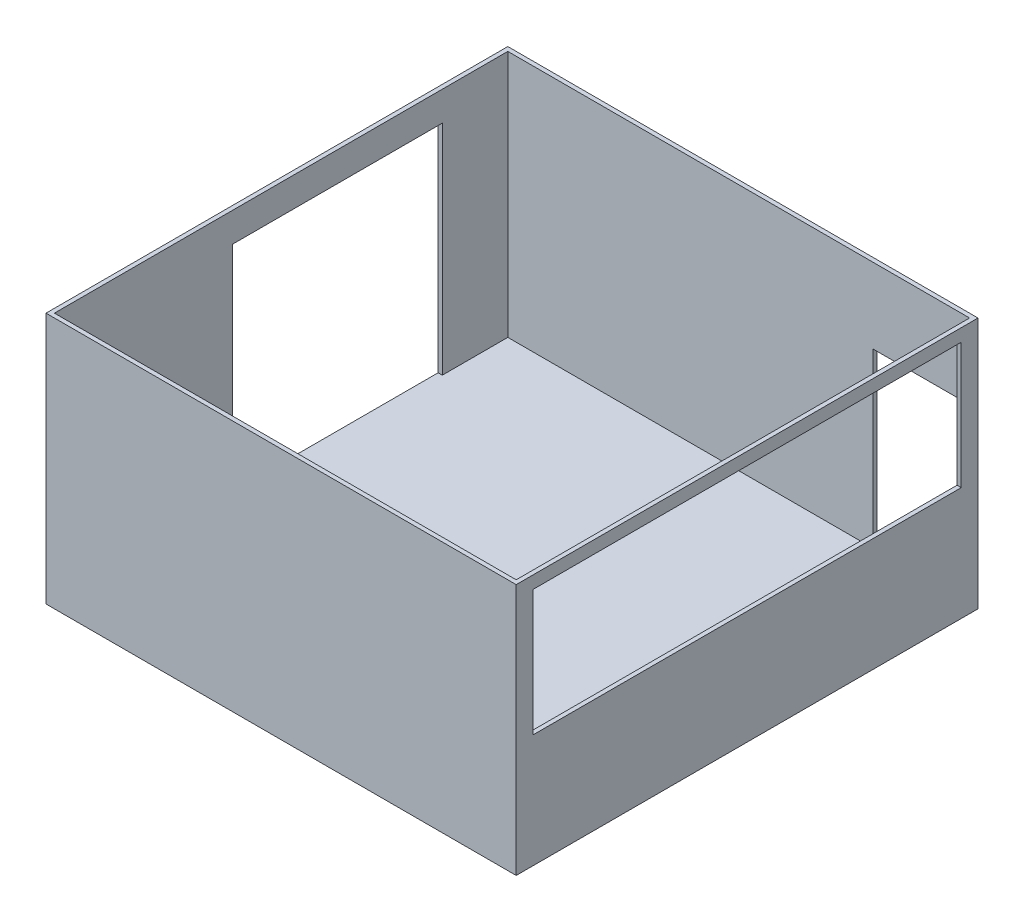
ISO-10303-21;
HEADER;
FILE_DESCRIPTION(('STEP AP214'),'2;1');
FILE_NAME('part.step','',(''),(''),'','','');
FILE_SCHEMA(('AUTOMOTIVE_DESIGN { 1 0 10303 214 1 1 1 1 }'));
ENDSEC;
DATA;
#1=APPLICATION_CONTEXT('core data for automotive mechanical design processes');
#2=APPLICATION_PROTOCOL_DEFINITION('international standard','automotive_design',2000,#1);
#3=PRODUCT_CONTEXT('',#1,'mechanical');
#4=PRODUCT('Part','Part','',(#3));
#5=PRODUCT_RELATED_PRODUCT_CATEGORY('part','',(#4));
#6=PRODUCT_DEFINITION_FORMATION('','',#4);
#7=PRODUCT_DEFINITION_CONTEXT('part definition',#1,'design');
#8=PRODUCT_DEFINITION('design','',#6,#7);
#9=PRODUCT_DEFINITION_SHAPE('','',#8);
#10=(LENGTH_UNIT() NAMED_UNIT(*) SI_UNIT(.MILLI.,.METRE.));
#11=(NAMED_UNIT(*) PLANE_ANGLE_UNIT() SI_UNIT($,.RADIAN.));
#12=(NAMED_UNIT(*) SI_UNIT($,.STERADIAN.) SOLID_ANGLE_UNIT());
#13=UNCERTAINTY_MEASURE_WITH_UNIT(LENGTH_MEASURE(1.E-05),#10,'distance_accuracy_value','');
#14=(GEOMETRIC_REPRESENTATION_CONTEXT(3) GLOBAL_UNCERTAINTY_ASSIGNED_CONTEXT((#13)) GLOBAL_UNIT_ASSIGNED_CONTEXT((#10,
#11,#12)) REPRESENTATION_CONTEXT('',''));
#15=CARTESIAN_POINT('',(0.,0.,0.));
#16=DIRECTION('',(0.,0.,1.));
#17=DIRECTION('',(1.,0.,0.));
#18=AXIS2_PLACEMENT_3D('',#15,#16,#17);
#19=CARTESIAN_POINT('',(2800.,-1500.,5500.));
#20=DIRECTION('',(-1.,0.,0.));
#21=DIRECTION('',(0.,0.,1.));
#22=AXIS2_PLACEMENT_3D('',#19,#20,#21);
#23=PLANE('',#22);
#24=DIRECTION('',(0.,1.,0.));
#25=VECTOR('',#24,1.);
#26=CARTESIAN_POINT('',(2800.,-1500.,0.));
#27=LINE('',#26,#25);
#28=CARTESIAN_POINT('',(2800.,-1500.,0.));
#29=VERTEX_POINT('',#28);
#30=CARTESIAN_POINT('',(2800.,1500.,0.));
#31=VERTEX_POINT('',#30);
#32=EDGE_CURVE('E319',#29,#31,#27,.T.);
#33=ORIENTED_EDGE('',*,*,#32,.T.);
#34=DIRECTION('',(0.,0.,-1.));
#35=VECTOR('',#34,1.);
#36=CARTESIAN_POINT('',(2800.,1500.,5500.));
#37=LINE('',#36,#35);
#38=CARTESIAN_POINT('',(2800.,1500.,5500.));
#39=VERTEX_POINT('',#38);
#40=EDGE_CURVE('E324',#39,#31,#37,.T.);
#41=ORIENTED_EDGE('',*,*,#40,.F.);
#42=DIRECTION('',(0.,1.,0.));
#43=VECTOR('',#42,1.);
#44=CARTESIAN_POINT('',(2800.,-1500.,5500.));
#45=LINE('',#44,#43);
#46=CARTESIAN_POINT('',(2800.,-1500.,5500.));
#47=VERTEX_POINT('',#46);
#48=EDGE_CURVE('E310',#47,#39,#45,.T.);
#49=ORIENTED_EDGE('',*,*,#48,.F.);
#50=DIRECTION('',(0.,0.,-1.));
#51=VECTOR('',#50,1.);
#52=CARTESIAN_POINT('',(2800.,-1500.,5500.));
#53=LINE('',#52,#51);
#54=EDGE_CURVE('E327',#47,#29,#53,.T.);
#55=ORIENTED_EDGE('',*,*,#54,.T.);
#56=EDGE_LOOP('',(#33,#41,#49,#55));
#57=FACE_BOUND('',#56,.T.);
#58=DIRECTION('',(0.,1.,0.));
#59=VECTOR('',#58,1.);
#60=CARTESIAN_POINT('',(2800.,0.,200.));
#61=LINE('',#60,#59);
#62=CARTESIAN_POINT('',(2800.,-150.,200.));
#63=VERTEX_POINT('',#62);
#64=CARTESIAN_POINT('',(2800.,1350.,200.));
#65=VERTEX_POINT('',#64);
#66=EDGE_CURVE('E182',#63,#65,#61,.T.);
#67=ORIENTED_EDGE('',*,*,#66,.F.);
#68=DIRECTION('',(0.,0.,-1.));
#69=VECTOR('',#68,1.);
#70=CARTESIAN_POINT('',(2800.,-150.,0.));
#71=LINE('',#70,#69);
#72=CARTESIAN_POINT('',(2800.,-149.999999999999,5300.));
#73=VERTEX_POINT('',#72);
#74=EDGE_CURVE('E174',#73,#63,#71,.T.);
#75=ORIENTED_EDGE('',*,*,#74,.F.);
#76=DIRECTION('',(0.,1.,0.));
#77=VECTOR('',#76,1.);
#78=CARTESIAN_POINT('',(2800.,0.,5300.));
#79=LINE('',#78,#77);
#80=CARTESIAN_POINT('',(2800.,1350.,5300.));
#81=VERTEX_POINT('',#80);
#82=EDGE_CURVE('E47',#73,#81,#79,.T.);
#83=ORIENTED_EDGE('',*,*,#82,.T.);
#84=DIRECTION('',(0.,0.,-1.));
#85=VECTOR('',#84,1.);
#86=CARTESIAN_POINT('',(2800.,1350.,-1.76329539205172E-13));
#87=LINE('',#86,#85);
#88=EDGE_CURVE('E186',#81,#65,#87,.T.);
#89=ORIENTED_EDGE('',*,*,#88,.T.);
#90=EDGE_LOOP('',(#67,#75,#83,#89));
#91=FACE_BOUND('',#90,.T.);
#92=ADVANCED_FACE('F32',(#57,#91),#23,.F.);
#93=CARTESIAN_POINT('',(2750.,-1500.,5500.));
#94=DIRECTION('',(-1.,0.,0.));
#95=DIRECTION('',(0.,0.,1.));
#96=AXIS2_PLACEMENT_3D('',#93,#94,#95);
#97=PLANE('',#96);
#98=DIRECTION('',(0.,1.,0.));
#99=VECTOR('',#98,1.);
#100=CARTESIAN_POINT('',(2750.,-1500.,49.9999999999998));
#101=LINE('',#100,#99);
#102=CARTESIAN_POINT('',(2750.,-1450.,50.));
#103=VERTEX_POINT('',#102);
#104=CARTESIAN_POINT('',(2750.,1500.,50.));
#105=VERTEX_POINT('',#104);
#106=EDGE_CURVE('E284',#103,#105,#101,.T.);
#107=ORIENTED_EDGE('',*,*,#106,.F.);
#108=DIRECTION('',(0.,0.,-1.));
#109=VECTOR('',#108,1.);
#110=CARTESIAN_POINT('',(2750.,-1450.,5500.));
#111=LINE('',#110,#109);
#112=CARTESIAN_POINT('',(2750.,-1450.,5450.));
#113=VERTEX_POINT('',#112);
#114=EDGE_CURVE('E286',#113,#103,#111,.T.);
#115=ORIENTED_EDGE('',*,*,#114,.F.);
#116=DIRECTION('',(0.,1.,0.));
#117=VECTOR('',#116,1.);
#118=CARTESIAN_POINT('',(2750.,-1500.,5450.));
#119=LINE('',#118,#117);
#120=CARTESIAN_POINT('',(2750.,1500.,5450.));
#121=VERTEX_POINT('',#120);
#122=EDGE_CURVE('E291',#113,#121,#119,.T.);
#123=ORIENTED_EDGE('',*,*,#122,.T.);
#124=DIRECTION('',(0.,0.,-1.));
#125=VECTOR('',#124,1.);
#126=CARTESIAN_POINT('',(2750.,1500.,5500.));
#127=LINE('',#126,#125);
#128=EDGE_CURVE('E289',#121,#105,#127,.T.);
#129=ORIENTED_EDGE('',*,*,#128,.T.);
#130=EDGE_LOOP('',(#107,#115,#123,#129));
#131=FACE_BOUND('',#130,.T.);
#132=DIRECTION('',(0.,0.,-1.));
#133=VECTOR('',#132,1.);
#134=CARTESIAN_POINT('',(2750.,-150.,0.));
#135=LINE('',#134,#133);
#136=CARTESIAN_POINT('',(2750.,-149.999999999999,5300.));
#137=VERTEX_POINT('',#136);
#138=CARTESIAN_POINT('',(2750.,-150.,200.));
#139=VERTEX_POINT('',#138);
#140=EDGE_CURVE('E199',#137,#139,#135,.T.);
#141=ORIENTED_EDGE('',*,*,#140,.T.);
#142=DIRECTION('',(0.,1.,0.));
#143=VECTOR('',#142,1.);
#144=CARTESIAN_POINT('',(2750.,0.,200.));
#145=LINE('',#144,#143);
#146=CARTESIAN_POINT('',(2750.,1350.,200.));
#147=VERTEX_POINT('',#146);
#148=EDGE_CURVE('E55',#139,#147,#145,.T.);
#149=ORIENTED_EDGE('',*,*,#148,.T.);
#150=DIRECTION('',(0.,0.,-1.));
#151=VECTOR('',#150,1.);
#152=CARTESIAN_POINT('',(2750.,1350.,-1.76329539205172E-13));
#153=LINE('',#152,#151);
#154=CARTESIAN_POINT('',(2750.,1350.,5300.));
#155=VERTEX_POINT('',#154);
#156=EDGE_CURVE('E190',#155,#147,#153,.T.);
#157=ORIENTED_EDGE('',*,*,#156,.F.);
#158=DIRECTION('',(0.,1.,0.));
#159=VECTOR('',#158,1.);
#160=CARTESIAN_POINT('',(2750.,0.,5300.));
#161=LINE('',#160,#159);
#162=EDGE_CURVE('E193',#137,#155,#161,.T.);
#163=ORIENTED_EDGE('',*,*,#162,.F.);
#164=EDGE_LOOP('',(#141,#149,#157,#163));
#165=FACE_BOUND('',#164,.T.);
#166=ADVANCED_FACE('F364',(#131,#165),#97,.T.);
#167=CARTESIAN_POINT('',(-2750.,-1500.,5500.));
#168=DIRECTION('',(1.,0.,0.));
#169=DIRECTION('',(0.,0.,-1.));
#170=AXIS2_PLACEMENT_3D('',#167,#168,#169);
#171=PLANE('',#170);
#172=DIRECTION('',(0.,0.,-1.));
#173=VECTOR('',#172,1.);
#174=CARTESIAN_POINT('',(-2750.,1150.,5500.));
#175=LINE('',#174,#173);
#176=CARTESIAN_POINT('',(-2750.,1150.,3330.));
#177=VERTEX_POINT('',#176);
#178=CARTESIAN_POINT('',(-2750.,1150.,830.));
#179=VERTEX_POINT('',#178);
#180=EDGE_CURVE('E40',#177,#179,#175,.T.);
#181=ORIENTED_EDGE('',*,*,#180,.T.);
#182=DIRECTION('',(0.,-1.,0.));
#183=VECTOR('',#182,1.);
#184=CARTESIAN_POINT('',(-2750.,-1500.,830.));
#185=LINE('',#184,#183);
#186=CARTESIAN_POINT('',(-2750.,-1450.,830.));
#187=VERTEX_POINT('',#186);
#188=EDGE_CURVE('E264',#179,#187,#185,.T.);
#189=ORIENTED_EDGE('',*,*,#188,.T.);
#190=DIRECTION('',(0.,0.,-1.));
#191=VECTOR('',#190,1.);
#192=CARTESIAN_POINT('',(-2750.,-1450.,5500.));
#193=LINE('',#192,#191);
#194=CARTESIAN_POINT('',(-2750.,-1450.,50.));
#195=VERTEX_POINT('',#194);
#196=EDGE_CURVE('E275',#187,#195,#193,.T.);
#197=ORIENTED_EDGE('',*,*,#196,.T.);
#198=DIRECTION('',(0.,-1.,0.));
#199=VECTOR('',#198,1.);
#200=CARTESIAN_POINT('',(-2750.,-1500.,49.9999999999998));
#201=LINE('',#200,#199);
#202=CARTESIAN_POINT('',(-2750.,1500.,50.));
#203=VERTEX_POINT('',#202);
#204=EDGE_CURVE('E267',#203,#195,#201,.T.);
#205=ORIENTED_EDGE('',*,*,#204,.F.);
#206=DIRECTION('',(0.,0.,-1.));
#207=VECTOR('',#206,1.);
#208=CARTESIAN_POINT('',(-2750.,1500.,5500.));
#209=LINE('',#208,#207);
#210=CARTESIAN_POINT('',(-2750.,1500.,5450.));
#211=VERTEX_POINT('',#210);
#212=EDGE_CURVE('E296',#211,#203,#209,.T.);
#213=ORIENTED_EDGE('',*,*,#212,.F.);
#214=DIRECTION('',(0.,-1.,0.));
#215=VECTOR('',#214,1.);
#216=CARTESIAN_POINT('',(-2750.,-1500.,5450.));
#217=LINE('',#216,#215);
#218=CARTESIAN_POINT('',(-2750.,-1450.,5450.));
#219=VERTEX_POINT('',#218);
#220=EDGE_CURVE('E276',#211,#219,#217,.T.);
#221=ORIENTED_EDGE('',*,*,#220,.T.);
#222=CARTESIAN_POINT('',(-2750.,-1450.,3330.));
#223=VERTEX_POINT('',#222);
#224=EDGE_CURVE('E271',#219,#223,#193,.T.);
#225=ORIENTED_EDGE('',*,*,#224,.T.);
#226=DIRECTION('',(0.,-1.,0.));
#227=VECTOR('',#226,1.);
#228=CARTESIAN_POINT('',(-2750.,-1500.,3330.));
#229=LINE('',#228,#227);
#230=EDGE_CURVE('E256',#177,#223,#229,.T.);
#231=ORIENTED_EDGE('',*,*,#230,.F.);
#232=EDGE_LOOP('',(#181,#189,#197,#205,#213,#221,#225,#231));
#233=FACE_BOUND('',#232,.T.);
#234=ADVANCED_FACE('F336',(#233),#171,.T.);
#235=CARTESIAN_POINT('',(2800.,1500.,5500.));
#236=DIRECTION('',(0.,-1.,0.));
#237=DIRECTION('',(1.,0.,0.));
#238=AXIS2_PLACEMENT_3D('',#235,#236,#237);
#239=PLANE('',#238);
#240=DIRECTION('',(-1.,0.,0.));
#241=VECTOR('',#240,1.);
#242=CARTESIAN_POINT('',(2800.,1500.,0.));
#243=LINE('',#242,#241);
#244=CARTESIAN_POINT('',(-2800.,1500.,0.));
#245=VERTEX_POINT('',#244);
#246=EDGE_CURVE('E308',#31,#245,#243,.T.);
#247=ORIENTED_EDGE('',*,*,#246,.T.);
#248=DIRECTION('',(0.,0.,-1.));
#249=VECTOR('',#248,1.);
#250=CARTESIAN_POINT('',(-2800.,1500.,5500.));
#251=LINE('',#250,#249);
#252=CARTESIAN_POINT('',(-2800.,1500.,5500.));
#253=VERTEX_POINT('',#252);
#254=EDGE_CURVE('E314',#253,#245,#251,.T.);
#255=ORIENTED_EDGE('',*,*,#254,.F.);
#256=DIRECTION('',(-1.,0.,0.));
#257=VECTOR('',#256,1.);
#258=CARTESIAN_POINT('',(2800.,1500.,5500.));
#259=LINE('',#258,#257);
#260=EDGE_CURVE('E312',#39,#253,#259,.T.);
#261=ORIENTED_EDGE('',*,*,#260,.F.);
#262=ORIENTED_EDGE('',*,*,#40,.T.);
#263=EDGE_LOOP('',(#247,#255,#261,#262));
#264=FACE_BOUND('',#263,.T.);
#265=DIRECTION('',(-1.,0.,0.));
#266=VECTOR('',#265,1.);
#267=CARTESIAN_POINT('',(2800.,1500.,49.9999999999998));
#268=LINE('',#267,#266);
#269=EDGE_CURVE('E280',#105,#203,#268,.T.);
#270=ORIENTED_EDGE('',*,*,#269,.F.);
#271=ORIENTED_EDGE('',*,*,#128,.F.);
#272=DIRECTION('',(-1.,0.,0.));
#273=VECTOR('',#272,1.);
#274=CARTESIAN_POINT('',(2800.,1500.,5450.));
#275=LINE('',#274,#273);
#276=EDGE_CURVE('E295',#121,#211,#275,.T.);
#277=ORIENTED_EDGE('',*,*,#276,.T.);
#278=ORIENTED_EDGE('',*,*,#212,.T.);
#279=EDGE_LOOP('',(#270,#271,#277,#278));
#280=FACE_BOUND('',#279,.T.);
#281=ADVANCED_FACE('F356',(#264,#280),#239,.F.);
#282=CARTESIAN_POINT('',(-2800.,-1500.,5500.));
#283=DIRECTION('',(1.,0.,0.));
#284=DIRECTION('',(0.,0.,-1.));
#285=AXIS2_PLACEMENT_3D('',#282,#283,#284);
#286=PLANE('',#285);
#287=DIRECTION('',(0.,1.,0.));
#288=VECTOR('',#287,1.);
#289=CARTESIAN_POINT('',(-2800.,-1450.,3330.));
#290=LINE('',#289,#288);
#291=CARTESIAN_POINT('',(-2800.,-1450.,3330.));
#292=VERTEX_POINT('',#291);
#293=CARTESIAN_POINT('',(-2800.,1150.,3330.));
#294=VERTEX_POINT('',#293);
#295=EDGE_CURVE('E244',#292,#294,#290,.T.);
#296=ORIENTED_EDGE('',*,*,#295,.F.);
#297=DIRECTION('',(0.,0.,1.));
#298=VECTOR('',#297,1.);
#299=CARTESIAN_POINT('',(-2800.,-1450.,830.));
#300=LINE('',#299,#298);
#301=CARTESIAN_POINT('',(-2800.,-1450.,830.));
#302=VERTEX_POINT('',#301);
#303=EDGE_CURVE('E235',#302,#292,#300,.T.);
#304=ORIENTED_EDGE('',*,*,#303,.F.);
#305=DIRECTION('',(0.,1.,0.));
#306=VECTOR('',#305,1.);
#307=CARTESIAN_POINT('',(-2800.,-1450.,830.));
#308=LINE('',#307,#306);
#309=CARTESIAN_POINT('',(-2800.,1150.,830.));
#310=VERTEX_POINT('',#309);
#311=EDGE_CURVE('E250',#302,#310,#308,.T.);
#312=ORIENTED_EDGE('',*,*,#311,.T.);
#313=DIRECTION('',(0.,0.,1.));
#314=VECTOR('',#313,1.);
#315=CARTESIAN_POINT('',(-2800.,1150.,830.));
#316=LINE('',#315,#314);
#317=EDGE_CURVE('E247',#310,#294,#316,.T.);
#318=ORIENTED_EDGE('',*,*,#317,.T.);
#319=EDGE_LOOP('',(#296,#304,#312,#318));
#320=FACE_BOUND('',#319,.T.);
#321=DIRECTION('',(0.,-1.,0.));
#322=VECTOR('',#321,1.);
#323=CARTESIAN_POINT('',(-2800.,-1500.,0.));
#324=LINE('',#323,#322);
#325=CARTESIAN_POINT('',(-2800.,-1500.,0.));
#326=VERTEX_POINT('',#325);
#327=EDGE_CURVE('E274',#245,#326,#324,.T.);
#328=ORIENTED_EDGE('',*,*,#327,.T.);
#329=DIRECTION('',(0.,0.,-1.));
#330=VECTOR('',#329,1.);
#331=CARTESIAN_POINT('',(-2800.,-1500.,5500.));
#332=LINE('',#331,#330);
#333=CARTESIAN_POINT('',(-2800.,-1500.,5500.));
#334=VERTEX_POINT('',#333);
#335=EDGE_CURVE('E330',#334,#326,#332,.T.);
#336=ORIENTED_EDGE('',*,*,#335,.F.);
#337=DIRECTION('',(0.,-1.,0.));
#338=VECTOR('',#337,1.);
#339=CARTESIAN_POINT('',(-2800.,-1500.,5500.));
#340=LINE('',#339,#338);
#341=EDGE_CURVE('E304',#253,#334,#340,.T.);
#342=ORIENTED_EDGE('',*,*,#341,.F.);
#343=ORIENTED_EDGE('',*,*,#254,.T.);
#344=EDGE_LOOP('',(#328,#336,#342,#343));
#345=FACE_BOUND('',#344,.T.);
#346=ADVANCED_FACE('F34',(#320,#345),#286,.F.);
#347=CARTESIAN_POINT('',(2800.,-1500.,5500.));
#348=DIRECTION('',(0.,1.,0.));
#349=DIRECTION('',(-1.,0.,0.));
#350=AXIS2_PLACEMENT_3D('',#347,#348,#349);
#351=PLANE('',#350);
#352=DIRECTION('',(1.,0.,0.));
#353=VECTOR('',#352,1.);
#354=CARTESIAN_POINT('',(2800.,-1500.,0.));
#355=LINE('',#354,#353);
#356=EDGE_CURVE('E317',#326,#29,#355,.T.);
#357=ORIENTED_EDGE('',*,*,#356,.T.);
#358=ORIENTED_EDGE('',*,*,#54,.F.);
#359=DIRECTION('',(1.,0.,0.));
#360=VECTOR('',#359,1.);
#361=CARTESIAN_POINT('',(2800.,-1500.,5500.));
#362=LINE('',#361,#360);
#363=EDGE_CURVE('E307',#334,#47,#362,.T.);
#364=ORIENTED_EDGE('',*,*,#363,.F.);
#365=ORIENTED_EDGE('',*,*,#335,.T.);
#366=EDGE_LOOP('',(#357,#358,#364,#365));
#367=FACE_BOUND('',#366,.T.);
#368=ADVANCED_FACE('F374',(#367),#351,.F.);
#369=CARTESIAN_POINT('',(0.,0.,5500.));
#370=DIRECTION('',(0.,0.,1.));
#371=DIRECTION('',(1.,0.,0.));
#372=AXIS2_PLACEMENT_3D('',#369,#370,#371);
#373=PLANE('',#372);
#374=ORIENTED_EDGE('',*,*,#341,.T.);
#375=ORIENTED_EDGE('',*,*,#363,.T.);
#376=ORIENTED_EDGE('',*,*,#48,.T.);
#377=ORIENTED_EDGE('',*,*,#260,.T.);
#378=EDGE_LOOP('',(#374,#375,#376,#377));
#379=FACE_BOUND('',#378,.T.);
#380=ADVANCED_FACE('F387',(#379),#373,.T.);
#381=CARTESIAN_POINT('',(0.,0.,0.));
#382=DIRECTION('',(0.,0.,1.));
#383=DIRECTION('',(1.,0.,0.));
#384=AXIS2_PLACEMENT_3D('',#381,#382,#383);
#385=PLANE('',#384);
#386=DIRECTION('',(-1.,0.,0.));
#387=VECTOR('',#386,1.);
#388=CARTESIAN_POINT('',(1600.,605.000000000001,0.));
#389=LINE('',#388,#387);
#390=CARTESIAN_POINT('',(2700.,605.000000000001,0.));
#391=VERTEX_POINT('',#390);
#392=CARTESIAN_POINT('',(1600.,605.000000000001,0.));
#393=VERTEX_POINT('',#392);
#394=EDGE_CURVE('E219',#391,#393,#389,.T.);
#395=ORIENTED_EDGE('',*,*,#394,.T.);
#396=DIRECTION('',(0.,-1.,0.));
#397=VECTOR('',#396,1.);
#398=CARTESIAN_POINT('',(1600.,605.000000000001,0.));
#399=LINE('',#398,#397);
#400=CARTESIAN_POINT('',(1600.,-1495.,0.));
#401=VERTEX_POINT('',#400);
#402=EDGE_CURVE('E209',#393,#401,#399,.T.);
#403=ORIENTED_EDGE('',*,*,#402,.T.);
#404=DIRECTION('',(1.,0.,0.));
#405=VECTOR('',#404,1.);
#406=CARTESIAN_POINT('',(1600.,-1495.,0.));
#407=LINE('',#406,#405);
#408=CARTESIAN_POINT('',(2700.,-1495.,0.));
#409=VERTEX_POINT('',#408);
#410=EDGE_CURVE('E212',#401,#409,#407,.T.);
#411=ORIENTED_EDGE('',*,*,#410,.T.);
#412=DIRECTION('',(0.,1.,0.));
#413=VECTOR('',#412,1.);
#414=CARTESIAN_POINT('',(2700.,605.000000000001,0.));
#415=LINE('',#414,#413);
#416=EDGE_CURVE('E216',#409,#391,#415,.T.);
#417=ORIENTED_EDGE('',*,*,#416,.T.);
#418=EDGE_LOOP('',(#395,#403,#411,#417));
#419=FACE_BOUND('',#418,.T.);
#420=ORIENTED_EDGE('',*,*,#327,.F.);
#421=ORIENTED_EDGE('',*,*,#246,.F.);
#422=ORIENTED_EDGE('',*,*,#32,.F.);
#423=ORIENTED_EDGE('',*,*,#356,.F.);
#424=EDGE_LOOP('',(#420,#421,#422,#423));
#425=FACE_BOUND('',#424,.T.);
#426=ADVANCED_FACE('F381',(#419,#425),#385,.F.);
#427=CARTESIAN_POINT('',(2800.,-1450.,5500.));
#428=DIRECTION('',(0.,1.,0.));
#429=DIRECTION('',(-1.,0.,0.));
#430=AXIS2_PLACEMENT_3D('',#427,#428,#429);
#431=PLANE('',#430);
#432=ORIENTED_EDGE('',*,*,#196,.F.);
#433=DIRECTION('',(-1.,0.,0.));
#434=VECTOR('',#433,1.);
#435=CARTESIAN_POINT('',(700.,-1450.,830.));
#436=LINE('',#435,#434);
#437=EDGE_CURVE('E254',#187,#302,#436,.T.);
#438=ORIENTED_EDGE('',*,*,#437,.T.);
#439=ORIENTED_EDGE('',*,*,#303,.T.);
#440=DIRECTION('',(-1.,0.,0.));
#441=VECTOR('',#440,1.);
#442=CARTESIAN_POINT('',(700.,-1450.,3330.));
#443=LINE('',#442,#441);
#444=EDGE_CURVE('E253',#223,#292,#443,.T.);
#445=ORIENTED_EDGE('',*,*,#444,.F.);
#446=ORIENTED_EDGE('',*,*,#224,.F.);
#447=DIRECTION('',(1.,0.,0.));
#448=VECTOR('',#447,1.);
#449=CARTESIAN_POINT('',(2800.,-1450.,5450.));
#450=LINE('',#449,#448);
#451=EDGE_CURVE('E279',#219,#113,#450,.T.);
#452=ORIENTED_EDGE('',*,*,#451,.T.);
#453=ORIENTED_EDGE('',*,*,#114,.T.);
#454=DIRECTION('',(1.,0.,0.));
#455=VECTOR('',#454,1.);
#456=CARTESIAN_POINT('',(2800.,-1450.,49.9999999999998));
#457=LINE('',#456,#455);
#458=CARTESIAN_POINT('',(2700.,-1450.,49.9999999999998));
#459=VERTEX_POINT('',#458);
#460=EDGE_CURVE('E270',#459,#103,#457,.T.);
#461=ORIENTED_EDGE('',*,*,#460,.F.);
#462=CARTESIAN_POINT('',(1600.,-1450.,50.));
#463=VERTEX_POINT('',#462);
#464=EDGE_CURVE('E285',#463,#459,#457,.T.);
#465=ORIENTED_EDGE('',*,*,#464,.F.);
#466=EDGE_CURVE('E281',#195,#463,#457,.T.);
#467=ORIENTED_EDGE('',*,*,#466,.F.);
#468=EDGE_LOOP('',(#432,#438,#439,#445,#446,#452,#453,#461,#465,#467));
#469=FACE_BOUND('',#468,.T.);
#470=ADVANCED_FACE('F347',(#469),#431,.T.);
#471=CARTESIAN_POINT('',(0.,0.,5450.));
#472=DIRECTION('',(0.,0.,1.));
#473=DIRECTION('',(1.,0.,0.));
#474=AXIS2_PLACEMENT_3D('',#471,#472,#473);
#475=PLANE('',#474);
#476=ORIENTED_EDGE('',*,*,#220,.F.);
#477=ORIENTED_EDGE('',*,*,#276,.F.);
#478=ORIENTED_EDGE('',*,*,#122,.F.);
#479=ORIENTED_EDGE('',*,*,#451,.F.);
#480=EDGE_LOOP('',(#476,#477,#478,#479));
#481=FACE_BOUND('',#480,.T.);
#482=ADVANCED_FACE('F360',(#481),#475,.F.);
#483=CARTESIAN_POINT('',(0.,0.,50.));
#484=DIRECTION('',(0.,0.,1.));
#485=DIRECTION('',(1.,0.,0.));
#486=AXIS2_PLACEMENT_3D('',#483,#484,#485);
#487=PLANE('',#486);
#488=DIRECTION('',(0.,-1.,0.));
#489=VECTOR('',#488,1.);
#490=CARTESIAN_POINT('',(1600.,605.000000000001,50.));
#491=LINE('',#490,#489);
#492=CARTESIAN_POINT('',(1600.,605.000000000001,50.));
#493=VERTEX_POINT('',#492);
#494=EDGE_CURVE('E223',#493,#463,#491,.T.);
#495=ORIENTED_EDGE('',*,*,#494,.F.);
#496=DIRECTION('',(-1.,0.,0.));
#497=VECTOR('',#496,1.);
#498=CARTESIAN_POINT('',(1600.,605.000000000001,50.));
#499=LINE('',#498,#497);
#500=CARTESIAN_POINT('',(2700.,605.000000000001,50.));
#501=VERTEX_POINT('',#500);
#502=EDGE_CURVE('E213',#501,#493,#499,.T.);
#503=ORIENTED_EDGE('',*,*,#502,.F.);
#504=DIRECTION('',(0.,1.,0.));
#505=VECTOR('',#504,1.);
#506=CARTESIAN_POINT('',(2700.,0.,50.));
#507=LINE('',#506,#505);
#508=EDGE_CURVE('E11',#459,#501,#507,.T.);
#509=ORIENTED_EDGE('',*,*,#508,.F.);
#510=ORIENTED_EDGE('',*,*,#460,.T.);
#511=ORIENTED_EDGE('',*,*,#106,.T.);
#512=ORIENTED_EDGE('',*,*,#269,.T.);
#513=ORIENTED_EDGE('',*,*,#204,.T.);
#514=ORIENTED_EDGE('',*,*,#466,.T.);
#515=EDGE_LOOP('',(#495,#503,#509,#510,#511,#512,#513,#514));
#516=FACE_BOUND('',#515,.T.);
#517=ADVANCED_FACE('F410',(#516),#487,.T.);
#518=CARTESIAN_POINT('',(700.,-1450.,830.));
#519=DIRECTION('',(0.,0.,1.));
#520=DIRECTION('',(1.,0.,0.));
#521=AXIS2_PLACEMENT_3D('',#518,#519,#520);
#522=PLANE('',#521);
#523=DIRECTION('',(-1.,0.,0.));
#524=VECTOR('',#523,1.);
#525=CARTESIAN_POINT('',(700.,1150.,830.));
#526=LINE('',#525,#524);
#527=EDGE_CURVE('E257',#179,#310,#526,.T.);
#528=ORIENTED_EDGE('',*,*,#527,.T.);
#529=ORIENTED_EDGE('',*,*,#311,.F.);
#530=ORIENTED_EDGE('',*,*,#437,.F.);
#531=ORIENTED_EDGE('',*,*,#188,.F.);
#532=EDGE_LOOP('',(#528,#529,#530,#531));
#533=FACE_BOUND('',#532,.T.);
#534=ADVANCED_FACE('F344',(#533),#522,.T.);
#535=CARTESIAN_POINT('',(700.,1150.,830.));
#536=DIRECTION('',(0.,-1.,0.));
#537=DIRECTION('',(0.,0.,-1.));
#538=AXIS2_PLACEMENT_3D('',#535,#536,#537);
#539=PLANE('',#538);
#540=DIRECTION('',(-1.,0.,0.));
#541=VECTOR('',#540,1.);
#542=CARTESIAN_POINT('',(700.,1150.,3330.));
#543=LINE('',#542,#541);
#544=EDGE_CURVE('E259',#177,#294,#543,.T.);
#545=ORIENTED_EDGE('',*,*,#544,.T.);
#546=ORIENTED_EDGE('',*,*,#317,.F.);
#547=ORIENTED_EDGE('',*,*,#527,.F.);
#548=ORIENTED_EDGE('',*,*,#180,.F.);
#549=EDGE_LOOP('',(#545,#546,#547,#548));
#550=FACE_BOUND('',#549,.T.);
#551=ADVANCED_FACE('F340',(#550),#539,.T.);
#552=CARTESIAN_POINT('',(700.,-1450.,3330.));
#553=DIRECTION('',(0.,0.,1.));
#554=DIRECTION('',(1.,0.,0.));
#555=AXIS2_PLACEMENT_3D('',#552,#553,#554);
#556=PLANE('',#555);
#557=ORIENTED_EDGE('',*,*,#230,.T.);
#558=ORIENTED_EDGE('',*,*,#444,.T.);
#559=ORIENTED_EDGE('',*,*,#295,.T.);
#560=ORIENTED_EDGE('',*,*,#544,.F.);
#561=EDGE_LOOP('',(#557,#558,#559,#560));
#562=FACE_BOUND('',#561,.T.);
#563=ADVANCED_FACE('F370',(#562),#556,.F.);
#564=CARTESIAN_POINT('',(1600.,605.000000000001,0.));
#565=DIRECTION('',(-1.,0.,0.));
#566=DIRECTION('',(0.,-1.,0.));
#567=AXIS2_PLACEMENT_3D('',#564,#565,#566);
#568=PLANE('',#567);
#569=ORIENTED_EDGE('',*,*,#494,.T.);
#570=CARTESIAN_POINT('',(1600.,-1495.,50.));
#571=VERTEX_POINT('',#570);
#572=EDGE_CURVE('E205',#463,#571,#491,.T.);
#573=ORIENTED_EDGE('',*,*,#572,.T.);
#574=DIRECTION('',(0.,0.,1.));
#575=VECTOR('',#574,1.);
#576=CARTESIAN_POINT('',(1600.,-1495.,0.));
#577=LINE('',#576,#575);
#578=EDGE_CURVE('E222',#401,#571,#577,.T.);
#579=ORIENTED_EDGE('',*,*,#578,.F.);
#580=ORIENTED_EDGE('',*,*,#402,.F.);
#581=DIRECTION('',(0.,0.,1.));
#582=VECTOR('',#581,1.);
#583=CARTESIAN_POINT('',(1600.,605.000000000001,0.));
#584=LINE('',#583,#582);
#585=EDGE_CURVE('E233',#393,#493,#584,.T.);
#586=ORIENTED_EDGE('',*,*,#585,.T.);
#587=EDGE_LOOP('',(#569,#573,#579,#580,#586));
#588=FACE_BOUND('',#587,.T.);
#589=ADVANCED_FACE('F421',(#588),#568,.F.);
#590=CARTESIAN_POINT('',(1600.,605.000000000001,0.));
#591=DIRECTION('',(0.,1.,0.));
#592=DIRECTION('',(-1.,0.,0.));
#593=AXIS2_PLACEMENT_3D('',#590,#591,#592);
#594=PLANE('',#593);
#595=ORIENTED_EDGE('',*,*,#502,.T.);
#596=ORIENTED_EDGE('',*,*,#585,.F.);
#597=ORIENTED_EDGE('',*,*,#394,.F.);
#598=DIRECTION('',(0.,0.,1.));
#599=VECTOR('',#598,1.);
#600=CARTESIAN_POINT('',(2700.,605.000000000001,0.));
#601=LINE('',#600,#599);
#602=EDGE_CURVE('E236',#391,#501,#601,.T.);
#603=ORIENTED_EDGE('',*,*,#602,.T.);
#604=EDGE_LOOP('',(#595,#596,#597,#603));
#605=FACE_BOUND('',#604,.T.);
#606=ADVANCED_FACE('F428',(#605),#594,.F.);
#607=CARTESIAN_POINT('',(2700.,605.000000000001,0.));
#608=DIRECTION('',(1.,0.,0.));
#609=DIRECTION('',(0.,0.,-1.));
#610=AXIS2_PLACEMENT_3D('',#607,#608,#609);
#611=PLANE('',#610);
#612=DIRECTION('',(0.,1.,0.));
#613=VECTOR('',#612,1.);
#614=CARTESIAN_POINT('',(2700.,605.000000000001,50.));
#615=LINE('',#614,#613);
#616=CARTESIAN_POINT('',(2700.,-1495.,50.));
#617=VERTEX_POINT('',#616);
#618=EDGE_CURVE('E229',#617,#459,#615,.T.);
#619=ORIENTED_EDGE('',*,*,#618,.T.);
#620=ORIENTED_EDGE('',*,*,#508,.T.);
#621=ORIENTED_EDGE('',*,*,#602,.F.);
#622=ORIENTED_EDGE('',*,*,#416,.F.);
#623=DIRECTION('',(0.,0.,1.));
#624=VECTOR('',#623,1.);
#625=CARTESIAN_POINT('',(2700.,-1495.,0.));
#626=LINE('',#625,#624);
#627=EDGE_CURVE('E239',#409,#617,#626,.T.);
#628=ORIENTED_EDGE('',*,*,#627,.T.);
#629=EDGE_LOOP('',(#619,#620,#621,#622,#628));
#630=FACE_BOUND('',#629,.T.);
#631=ADVANCED_FACE('F434',(#630),#611,.F.);
#632=CARTESIAN_POINT('',(1600.,-1495.,0.));
#633=DIRECTION('',(0.,-1.,0.));
#634=DIRECTION('',(1.,0.,0.));
#635=AXIS2_PLACEMENT_3D('',#632,#633,#634);
#636=PLANE('',#635);
#637=DIRECTION('',(1.,0.,0.));
#638=VECTOR('',#637,1.);
#639=CARTESIAN_POINT('',(1600.,-1495.,50.));
#640=LINE('',#639,#638);
#641=EDGE_CURVE('E226',#571,#617,#640,.T.);
#642=ORIENTED_EDGE('',*,*,#641,.T.);
#643=ORIENTED_EDGE('',*,*,#627,.F.);
#644=ORIENTED_EDGE('',*,*,#410,.F.);
#645=ORIENTED_EDGE('',*,*,#578,.T.);
#646=EDGE_LOOP('',(#642,#643,#644,#645));
#647=FACE_BOUND('',#646,.T.);
#648=ADVANCED_FACE('F430',(#647),#636,.F.);
#649=CARTESIAN_POINT('',(0.,0.,50.));
#650=DIRECTION('',(0.,0.,1.));
#651=DIRECTION('',(1.,0.,0.));
#652=AXIS2_PLACEMENT_3D('',#649,#650,#651);
#653=PLANE('',#652);
#654=ORIENTED_EDGE('',*,*,#464,.T.);
#655=ORIENTED_EDGE('',*,*,#618,.F.);
#656=ORIENTED_EDGE('',*,*,#641,.F.);
#657=ORIENTED_EDGE('',*,*,#572,.F.);
#658=EDGE_LOOP('',(#654,#655,#656,#657));
#659=FACE_BOUND('',#658,.T.);
#660=ADVANCED_FACE('F433',(#659),#653,.F.);
#661=CARTESIAN_POINT('',(2800.,0.,200.));
#662=DIRECTION('',(0.,0.,1.));
#663=DIRECTION('',(1.,0.,0.));
#664=AXIS2_PLACEMENT_3D('',#661,#662,#663);
#665=PLANE('',#664);
#666=ORIENTED_EDGE('',*,*,#148,.F.);
#667=DIRECTION('',(-1.,0.,0.));
#668=VECTOR('',#667,1.);
#669=CARTESIAN_POINT('',(2800.,-150.,200.));
#670=LINE('',#669,#668);
#671=EDGE_CURVE('E177',#63,#139,#670,.T.);
#672=ORIENTED_EDGE('',*,*,#671,.F.);
#673=ORIENTED_EDGE('',*,*,#66,.T.);
#674=DIRECTION('',(-1.,0.,0.));
#675=VECTOR('',#674,1.);
#676=CARTESIAN_POINT('',(2800.,1350.,200.));
#677=LINE('',#676,#675);
#678=EDGE_CURVE('E203',#65,#147,#677,.T.);
#679=ORIENTED_EDGE('',*,*,#678,.T.);
#680=EDGE_LOOP('',(#666,#672,#673,#679));
#681=FACE_BOUND('',#680,.T.);
#682=ADVANCED_FACE('F184',(#681),#665,.T.);
#683=CARTESIAN_POINT('',(2800.,1350.,-1.76329539205172E-13));
#684=DIRECTION('',(0.,1.,0.));
#685=DIRECTION('',(0.,0.,1.));
#686=AXIS2_PLACEMENT_3D('',#683,#684,#685);
#687=PLANE('',#686);
#688=ORIENTED_EDGE('',*,*,#156,.T.);
#689=ORIENTED_EDGE('',*,*,#678,.F.);
#690=ORIENTED_EDGE('',*,*,#88,.F.);
#691=DIRECTION('',(-1.,0.,0.));
#692=VECTOR('',#691,1.);
#693=CARTESIAN_POINT('',(2800.,1350.,5300.));
#694=LINE('',#693,#692);
#695=EDGE_CURVE('E206',#81,#155,#694,.T.);
#696=ORIENTED_EDGE('',*,*,#695,.T.);
#697=EDGE_LOOP('',(#688,#689,#690,#696));
#698=FACE_BOUND('',#697,.T.);
#699=ADVANCED_FACE('F447',(#698),#687,.F.);
#700=CARTESIAN_POINT('',(2800.,0.,5300.));
#701=DIRECTION('',(0.,0.,1.));
#702=DIRECTION('',(1.,0.,0.));
#703=AXIS2_PLACEMENT_3D('',#700,#701,#702);
#704=PLANE('',#703);
#705=ORIENTED_EDGE('',*,*,#162,.T.);
#706=ORIENTED_EDGE('',*,*,#695,.F.);
#707=ORIENTED_EDGE('',*,*,#82,.F.);
#708=DIRECTION('',(-1.,0.,0.));
#709=VECTOR('',#708,1.);
#710=CARTESIAN_POINT('',(2800.,-149.999999999999,5300.));
#711=LINE('',#710,#709);
#712=EDGE_CURVE('E179',#73,#137,#711,.T.);
#713=ORIENTED_EDGE('',*,*,#712,.T.);
#714=EDGE_LOOP('',(#705,#706,#707,#713));
#715=FACE_BOUND('',#714,.T.);
#716=ADVANCED_FACE('F450',(#715),#704,.F.);
#717=CARTESIAN_POINT('',(2800.,-150.,0.));
#718=DIRECTION('',(0.,1.,0.));
#719=DIRECTION('',(0.,0.,1.));
#720=AXIS2_PLACEMENT_3D('',#717,#718,#719);
#721=PLANE('',#720);
#722=ORIENTED_EDGE('',*,*,#140,.F.);
#723=ORIENTED_EDGE('',*,*,#712,.F.);
#724=ORIENTED_EDGE('',*,*,#74,.T.);
#725=ORIENTED_EDGE('',*,*,#671,.T.);
#726=EDGE_LOOP('',(#722,#723,#724,#725));
#727=FACE_BOUND('',#726,.T.);
#728=ADVANCED_FACE('F176',(#727),#721,.T.);
#729=CLOSED_SHELL('',(#92,#166,#234,#281,#346,#368,#380,#426,#470,#482,#517,#534,#551,#563,#589,
#606,#631,#648,#660,#682,#699,#716,#728));
#730=MANIFOLD_SOLID_BREP('B2',#729);
#731=ADVANCED_BREP_SHAPE_REPRESENTATION('',(#18,#730),#14);
#732=SHAPE_DEFINITION_REPRESENTATION(#9,#731);
ENDSEC;
END-ISO-10303-21;
